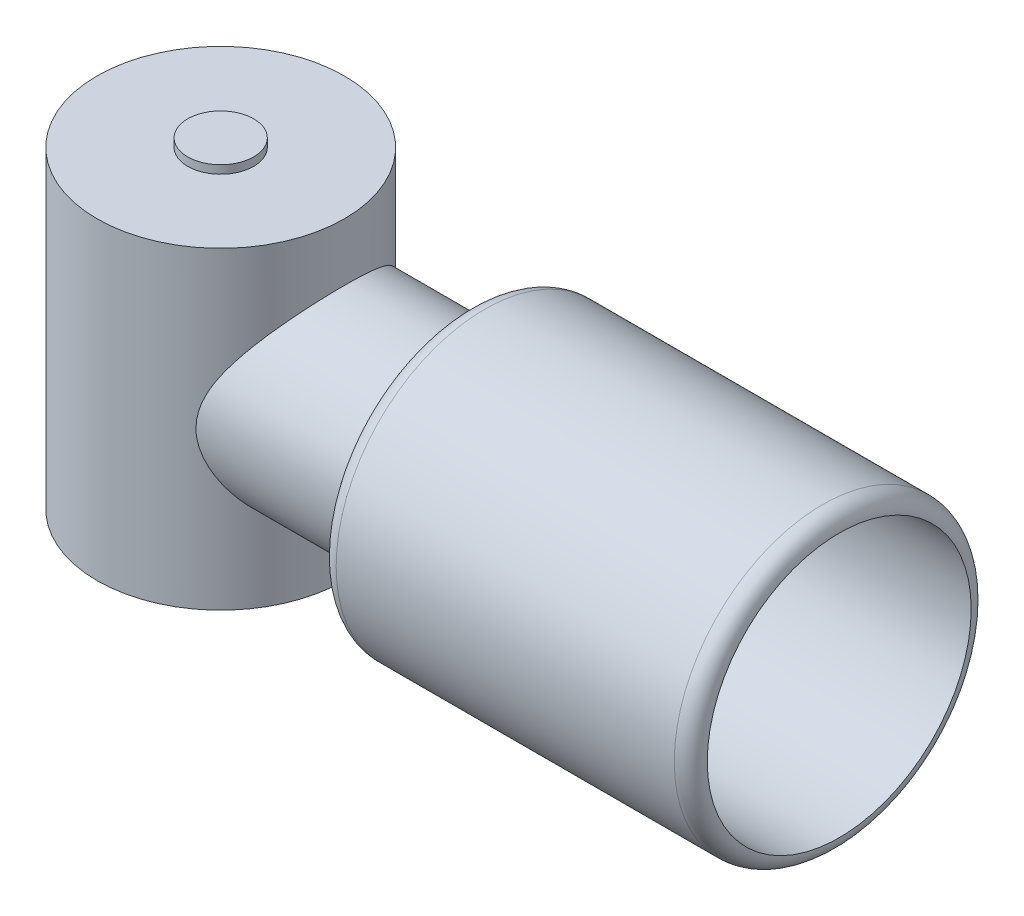
ISO-10303-21;
HEADER;
FILE_DESCRIPTION(('STEP AP214'),'2;1');
FILE_NAME('part.step','',(''),(''),'','','');
FILE_SCHEMA(('AUTOMOTIVE_DESIGN { 1 0 10303 214 1 1 1 1 }'));
ENDSEC;
DATA;
#1=APPLICATION_CONTEXT('core data for automotive mechanical design processes');
#2=APPLICATION_PROTOCOL_DEFINITION('international standard','automotive_design',2000,#1);
#3=PRODUCT_CONTEXT('',#1,'mechanical');
#4=PRODUCT('Part','Part','',(#3));
#5=PRODUCT_RELATED_PRODUCT_CATEGORY('part','',(#4));
#6=PRODUCT_DEFINITION_FORMATION('','',#4);
#7=PRODUCT_DEFINITION_CONTEXT('part definition',#1,'design');
#8=PRODUCT_DEFINITION('design','',#6,#7);
#9=PRODUCT_DEFINITION_SHAPE('','',#8);
#10=(LENGTH_UNIT() NAMED_UNIT(*) SI_UNIT(.MILLI.,.METRE.));
#11=(NAMED_UNIT(*) PLANE_ANGLE_UNIT() SI_UNIT($,.RADIAN.));
#12=(NAMED_UNIT(*) SI_UNIT($,.STERADIAN.) SOLID_ANGLE_UNIT());
#13=UNCERTAINTY_MEASURE_WITH_UNIT(LENGTH_MEASURE(1.E-05),#10,'distance_accuracy_value','');
#14=(GEOMETRIC_REPRESENTATION_CONTEXT(3) GLOBAL_UNCERTAINTY_ASSIGNED_CONTEXT((#13)) GLOBAL_UNIT_ASSIGNED_CONTEXT((#10,
#11,#12)) REPRESENTATION_CONTEXT('',''));
#15=CARTESIAN_POINT('',(0.,0.,0.));
#16=DIRECTION('',(0.,0.,1.));
#17=DIRECTION('',(1.,0.,0.));
#18=AXIS2_PLACEMENT_3D('',#15,#16,#17);
#19=CARTESIAN_POINT('',(0.,20.,0.));
#20=DIRECTION('',(0.,1.,0.));
#21=DIRECTION('',(0.,0.,1.));
#22=AXIS2_PLACEMENT_3D('',#19,#20,#21);
#23=CYLINDRICAL_SURFACE('',#22,15.);
#24=CARTESIAN_POINT('',(0.,-19.,0.));
#25=DIRECTION('',(0.,1.,0.));
#26=DIRECTION('',(0.,0.,1.));
#27=AXIS2_PLACEMENT_3D('',#24,#25,#26);
#28=CIRCLE('',#27,15.);
#29=CARTESIAN_POINT('',(0.,-19.,15.));
#30=VERTEX_POINT('',#29);
#31=EDGE_CURVE('E119',#30,#30,#28,.T.);
#32=ORIENTED_EDGE('',*,*,#31,.T.);
#33=EDGE_LOOP('',(#32));
#34=FACE_BOUND('',#33,.T.);
#35=CARTESIAN_POINT('',(0.,19.,0.));
#36=DIRECTION('',(0.,1.,0.));
#37=DIRECTION('',(0.,0.,1.));
#38=AXIS2_PLACEMENT_3D('',#35,#36,#37);
#39=CIRCLE('',#38,15.);
#40=CARTESIAN_POINT('',(0.,19.,15.));
#41=VERTEX_POINT('',#40);
#42=EDGE_CURVE('E57',#41,#41,#39,.T.);
#43=ORIENTED_EDGE('',*,*,#42,.F.);
#44=EDGE_LOOP('',(#43));
#45=FACE_BOUND('',#44,.T.);
#46=CARTESIAN_POINT('',(9.,0.,12.));
#47=CARTESIAN_POINT('',(9.00000534593475,0.225336896711603,11.9999977580923));
#48=CARTESIAN_POINT('',(9.00850517220196,0.450756200763366,11.9936356792837));
#49=CARTESIAN_POINT('',(9.04208551213308,0.899734141055137,11.9683378604446));
#50=CARTESIAN_POINT('',(9.06717733210229,1.12329140317996,11.9493935464452));
#51=CARTESIAN_POINT('',(9.13280932479141,1.56734322734625,11.899306326707));
#52=CARTESIAN_POINT('',(9.17339097684819,1.78782790382989,11.8681306610259));
#53=CARTESIAN_POINT('',(9.26824142745593,2.22388067664312,11.794206381086));
#54=CARTESIAN_POINT('',(9.32251506112583,2.43944700674687,11.7514536781771));
#55=CARTESIAN_POINT('',(9.46368365421338,2.93887172207276,11.6382758692652));
#56=CARTESIAN_POINT('',(9.55535701328816,3.22037289072252,11.5633987228413));
#57=CARTESIAN_POINT('',(9.75505249858976,3.77190253392778,11.3954358396261));
#58=CARTESIAN_POINT('',(9.86308203930986,4.04192573389168,11.302341839246));
#59=CARTESIAN_POINT('',(10.0913575975156,4.57083581680915,11.0990049699733));
#60=CARTESIAN_POINT('',(10.2116306750283,4.82969614981719,10.9887238164715));
#61=CARTESIAN_POINT('',(10.4604790537847,5.3357414022928,10.7521105598145));
#62=CARTESIAN_POINT('',(10.5890541442799,5.58292661786045,10.6257788640274));
#63=CARTESIAN_POINT('',(10.8988977434831,6.15323654333372,10.3091795170634));
#64=CARTESIAN_POINT('',(11.0824071596072,6.47149718215693,10.1123119228316));
#65=CARTESIAN_POINT('',(11.4528018887125,7.08710328868032,9.69082806297777));
#66=CARTESIAN_POINT('',(11.639688392718,7.38444118903451,9.46620183773787));
#67=CARTESIAN_POINT('',(12.011402413245,7.9574653550963,8.98985147043489));
#68=CARTESIAN_POINT('',(12.1962314628727,8.23316881829286,8.73814923666884));
#69=CARTESIAN_POINT('',(12.5592749633941,8.76198044386478,8.2077913274691));
#70=CARTESIAN_POINT('',(12.7374916020085,9.01509611908128,7.92914467865136));
#71=CARTESIAN_POINT('',(13.0488265703224,9.44933805059659,7.402856556035));
#72=CARTESIAN_POINT('',(13.1839031479475,9.63481232603252,7.15995147078525));
#73=CARTESIAN_POINT('',(13.4447133432109,9.98872497570729,6.65731250510476));
#74=CARTESIAN_POINT('',(13.5704487658596,10.1571666434748,6.39758189415741));
#75=CARTESIAN_POINT('',(13.8101743447818,10.4752961726256,5.86216844144648));
#76=CARTESIAN_POINT('',(13.92417827856,10.6250060783418,5.58650491979562));
#77=CARTESIAN_POINT('',(14.1383188864075,10.9041310881523,5.01992015578025));
#78=CARTESIAN_POINT('',(14.2384578605831,11.033549558936,4.72900145521727));
#79=CARTESIAN_POINT('',(14.4077438286833,11.2510868305872,4.18153490678308));
#80=CARTESIAN_POINT('',(14.4792839768026,11.3424999266453,3.92703273938234));
#81=CARTESIAN_POINT('',(14.6098022890139,11.5086475232899,3.40952368941159));
#82=CARTESIAN_POINT('',(14.6687828468481,11.5833852021872,3.14651843847694));
#83=CARTESIAN_POINT('',(14.7730555818549,11.7151523068893,2.61352930324073));
#84=CARTESIAN_POINT('',(14.8183523671225,11.772187694228,2.34354780155634));
#85=CARTESIAN_POINT('',(14.8943597076263,11.8677204874231,1.79828043764154));
#86=CARTESIAN_POINT('',(14.9250700886937,11.9062176719243,1.52299451211453));
#87=CARTESIAN_POINT('',(14.9713198002126,11.9641432051067,0.968164357538668));
#88=CARTESIAN_POINT('',(14.9868054893703,11.9835041321099,0.688608571497582));
#89=CARTESIAN_POINT('',(15.0020675270665,12.0025856866991,0.128395225325741));
#90=CARTESIAN_POINT('',(15.0018438453866,12.0023062765053,-0.15226233692334));
#91=CARTESIAN_POINT('',(14.9856922836252,11.9821120630282,-0.712420795127686));
#92=CARTESIAN_POINT('',(14.9697638718,11.9621965948912,-0.991921651596474));
#93=CARTESIAN_POINT('',(14.9225608310613,11.9030726502118,-1.54755149431533));
#94=CARTESIAN_POINT('',(14.8912865561,11.863864618652,-1.8236805581852));
#95=CARTESIAN_POINT('',(14.8161869606421,11.769459009883,-2.35558281632852));
#96=CARTESIAN_POINT('',(14.773140913335,11.7152523026543,-2.61164379383935));
#97=CARTESIAN_POINT('',(14.6747403868935,11.590920979812,-3.11743003424172));
#98=CARTESIAN_POINT('',(14.6193864604449,11.5207970789574,-3.36715558106512));
#99=CARTESIAN_POINT('',(14.4973196866331,11.3654996258046,-3.85900682695143));
#100=CARTESIAN_POINT('',(14.4306071040396,11.2803264243028,-4.10113270300635));
#101=CARTESIAN_POINT('',(14.2868526958553,11.0958327045157,-4.57685684863348));
#102=CARTESIAN_POINT('',(14.2098070902368,10.9965070081288,-4.81045195750258));
#103=CARTESIAN_POINT('',(14.0386849302236,10.7745137304916,-5.29020351270808));
#104=CARTESIAN_POINT('',(13.9436836975575,10.6505211723526,-5.53541648917584));
#105=CARTESIAN_POINT('',(13.7441012083129,10.3878588269558,-6.01389375128235));
#106=CARTESIAN_POINT('',(13.639515998348,10.2491829791481,-6.24715304360806));
#107=CARTESIAN_POINT('',(13.4222867655211,9.95827031972049,-6.70116079175292));
#108=CARTESIAN_POINT('',(13.3096414330644,9.80603130339082,-6.92190720401076));
#109=CARTESIAN_POINT('',(13.0777952173513,9.48896320243383,-7.35055533838977));
#110=CARTESIAN_POINT('',(12.9585934504079,9.3241324194974,-7.55845532098987));
#111=CARTESIAN_POINT('',(12.6900383983145,8.94751048465738,-8.00271521596878));
#112=CARTESIAN_POINT('',(12.5395331598783,8.73304115456968,-8.23611297709571));
#113=CARTESIAN_POINT('',(12.2337954887429,8.28805787975432,-8.68376254470619));
#114=CARTESIAN_POINT('',(12.0785622801605,8.0575412935257,-8.89801118577888));
#115=CARTESIAN_POINT('',(11.7659701803067,7.58092820787633,-9.3074350269514));
#116=CARTESIAN_POINT('',(11.6086090232722,7.33481387047092,-9.50258771538535));
#117=CARTESIAN_POINT('',(11.294987904498,6.82762773451224,-9.87330575529426));
#118=CARTESIAN_POINT('',(11.1387278129911,6.56655773284215,-10.0488734524144));
#119=CARTESIAN_POINT('',(10.8456285701826,6.05534297449387,-10.3640770356156));
#120=CARTESIAN_POINT('',(10.7083687628107,5.80656894162597,-10.5055450880884));
#121=CARTESIAN_POINT('',(10.4406280449055,5.29658673401075,-10.7716712253137));
#122=CARTESIAN_POINT('',(10.3101479108546,5.03537714154345,-10.8963273871821));
#123=CARTESIAN_POINT('',(10.0598945660622,4.50079770174653,-11.127781438788));
#124=CARTESIAN_POINT('',(9.94010336563904,4.22744949163076,-11.2346096076448));
#125=CARTESIAN_POINT('',(9.71545920331954,3.66819107573167,-11.4294337233122));
#126=CARTESIAN_POINT('',(9.6105994167876,3.38228668763677,-11.5174382830424));
#127=CARTESIAN_POINT('',(9.44968675371334,2.88680416673891,-11.6494960772356));
#128=CARTESIAN_POINT('',(9.38846449265114,2.68029528399006,-11.6987920140373));
#129=CARTESIAN_POINT('',(9.2777107829465,2.26198146148384,-11.7868184866234));
#130=CARTESIAN_POINT('',(9.22817554442481,2.0501782632809,-11.8255524480921));
#131=CARTESIAN_POINT('',(9.14268537794491,1.62249532276166,-11.8917717881921));
#132=CARTESIAN_POINT('',(9.10670582705021,1.40662372696992,-11.9192775696726));
#133=CARTESIAN_POINT('',(9.04974037513238,0.971724159331152,-11.9625871257979));
#134=CARTESIAN_POINT('',(9.02875414446727,0.752696256986462,-11.9783911577167));
#135=CARTESIAN_POINT('',(9.0026974595874,0.311845158225692,-11.9979879090824));
#136=CARTESIAN_POINT('',(8.99772158485407,0.0900130946441699,-12.0017092524971));
#137=CARTESIAN_POINT('',(9.00420338653544,-0.353266956490721,-11.9968468999912));
#138=CARTESIAN_POINT('',(9.01566080041498,-0.574714950123332,-11.9882634006506));
#139=CARTESIAN_POINT('',(9.05446038718717,-1.01565602582054,-11.9589852981963));
#140=CARTESIAN_POINT('',(9.08182159873641,-1.235146444134,-11.9382761791167));
#141=CARTESIAN_POINT('',(9.15117000529865,-1.6703626046178,-11.8851999983202));
#142=CARTESIAN_POINT('',(9.19315944953477,-1.88608776248571,-11.8528311437874));
#143=CARTESIAN_POINT('',(9.30237226944531,-2.36684969919688,-11.767404866684));
#144=CARTESIAN_POINT('',(9.37329680354322,-2.63048258931296,-11.7111800615462));
#145=CARTESIAN_POINT('',(9.53169041225851,-3.14866455280832,-11.5826272346947));
#146=CARTESIAN_POINT('',(9.61916464787385,-3.40321076300767,-11.5102941884025));
#147=CARTESIAN_POINT('',(9.8072143141123,-3.90323844261763,-11.3504975837445));
#148=CARTESIAN_POINT('',(9.90782137116947,-4.14869613190217,-11.2629973273402));
#149=CARTESIAN_POINT('',(10.1187031677338,-4.62978238656042,-11.0739298315741));
#150=CARTESIAN_POINT('',(10.2289783422763,-4.86541050892918,-10.9723619590936));
#151=CARTESIAN_POINT('',(10.5084827361846,-5.43268904622767,-10.7062636987059));
#152=CARTESIAN_POINT('',(10.6815885441585,-5.75891245063317,-10.5341964728359));
#153=CARTESIAN_POINT('',(11.0353879957735,-6.39127560933784,-10.1629755601994));
#154=CARTESIAN_POINT('',(11.2160847339051,-6.69740704012451,-9.96381075139339));
#155=CARTESIAN_POINT('',(11.5796099570042,-7.28986204305585,-9.53891479302859));
#156=CARTESIAN_POINT('',(11.762440368408,-7.57616578465706,-9.31315763963954));
#157=CARTESIAN_POINT('',(12.1252591020044,-8.12804339611084,-8.83561129980881));
#158=CARTESIAN_POINT('',(12.305247864177,-8.39362050073752,-8.58382618982565));
#159=CARTESIAN_POINT('',(12.6606482097247,-8.90655212570027,-8.05059758256504));
#160=CARTESIAN_POINT('',(12.8359571276623,-9.15359067803856,-7.76878052176302));
#161=CARTESIAN_POINT('',(13.1749823285129,-9.62322937695186,-7.17882893969065));
#162=CARTESIAN_POINT('',(13.3386967957586,-9.84582569891477,-6.87069031311184));
#163=CARTESIAN_POINT('',(13.649771306,-10.2633117941736,-6.22979022830051));
#164=CARTESIAN_POINT('',(13.7971750507411,-10.4582760174077,-5.89709875384123));
#165=CARTESIAN_POINT('',(14.0717725733971,-10.8179605313504,-5.20793427353997));
#166=CARTESIAN_POINT('',(14.1989777884893,-10.9826979459094,-4.85147488953823));
#167=CARTESIAN_POINT('',(14.3918639295043,-11.2307474212978,-4.23582765275947));
#168=CARTESIAN_POINT('',(14.4641564081937,-11.3231855673311,-3.98234304396571));
#169=CARTESIAN_POINT('',(14.5963013919825,-11.4915072325241,-3.46680405317605));
#170=CARTESIAN_POINT('',(14.6561571368553,-11.5673950633028,-3.20475192366046));
#171=CARTESIAN_POINT('',(14.762284185155,-11.7015690265281,-2.67362457217041));
#172=CARTESIAN_POINT('',(14.8085626808371,-11.7598644786282,-2.40455315107506));
#173=CARTESIAN_POINT('',(14.8866437379393,-11.8580372963764,-1.86097328134196));
#174=CARTESIAN_POINT('',(14.9184457847463,-11.8979140072703,-1.58646463978217));
#175=CARTESIAN_POINT('',(14.9669763510529,-11.9587088938429,-1.03299041128298));
#176=CARTESIAN_POINT('',(14.9836488249953,-11.9795565806018,-0.754012117346419));
#177=CARTESIAN_POINT('',(15.0013439104118,-12.001681697319,-0.194782200523185));
#178=CARTESIAN_POINT('',(15.0023665840164,-12.0029592049719,0.0854694173039015));
#179=CARTESIAN_POINT('',(14.9887388212363,-11.9859216240038,0.645007534582207));
#180=CARTESIAN_POINT('',(14.9740873811682,-11.9676052807008,0.924293971079601));
#181=CARTESIAN_POINT('',(14.9294394667087,-11.9116936608859,1.47967817069084));
#182=CARTESIAN_POINT('',(14.8994433282722,-11.8740988064553,1.75577600348025));
#183=CARTESIAN_POINT('',(14.8267670165045,-11.7827730106711,2.28806316164965));
#184=CARTESIAN_POINT('',(14.7848534588453,-11.7300156997351,2.54452601505301));
#185=CARTESIAN_POINT('',(14.6886493555422,-11.6085225610409,3.05124308760346));
#186=CARTESIAN_POINT('',(14.6343593541509,-11.5397874359023,3.30149757922603));
#187=CARTESIAN_POINT('',(14.5143388793052,-11.3871968556772,3.79451477268354));
#188=CARTESIAN_POINT('',(14.4486085965491,-11.3033416526266,4.03727759931777));
#189=CARTESIAN_POINT('',(14.3067293996473,-11.1214094781016,4.5143618190359));
#190=CARTESIAN_POINT('',(14.2305766656746,-11.0233272916472,4.74868007722489));
#191=CARTESIAN_POINT('',(14.0614917890715,-10.8042052337636,5.22926411473353));
#192=CARTESIAN_POINT('',(13.9676588223078,-10.6818804361256,5.47462651417379));
#193=CARTESIAN_POINT('',(13.7703500197772,-10.4225535654067,5.95353455838647));
#194=CARTESIAN_POINT('',(13.6668702096938,-10.2855454395644,6.18707527116559));
#195=CARTESIAN_POINT('',(13.4517774578086,-9.99797129990693,6.64175743833844));
#196=CARTESIAN_POINT('',(13.3401634313978,-9.84740347742059,6.86289723222285));
#197=CARTESIAN_POINT('',(13.1102887347224,-9.53368059422796,7.29244028447891));
#198=CARTESIAN_POINT('',(12.9920271661101,-9.37052383113841,7.5008418134213));
#199=CARTESIAN_POINT('',(12.725599157349,-8.99784296604335,7.94603518839181));
#200=CARTESIAN_POINT('',(12.5762654811263,-8.78566284790588,8.1799095046407));
#201=CARTESIAN_POINT('',(12.2726946544094,-8.3453271941456,8.62869484516627));
#202=CARTESIAN_POINT('',(12.1184567176533,-8.11716908977388,8.84360280764965));
#203=CARTESIAN_POINT('',(11.8076247385765,-7.64536160607647,9.25453594237483));
#204=CARTESIAN_POINT('',(11.6510281298568,-7.40169425756251,9.45053852438702));
#205=CARTESIAN_POINT('',(11.3386357369434,-6.89951704412927,9.82315741867348));
#206=CARTESIAN_POINT('',(11.1828398660056,-6.64100882549096,9.99977587490246));
#207=CARTESIAN_POINT('',(10.8878533098686,-6.13067100428086,10.3197919837101));
#208=CARTESIAN_POINT('',(10.7483380158318,-5.87998929242402,10.4647207743406));
#209=CARTESIAN_POINT('',(10.4759374491282,-5.36589302044452,10.7374048504859));
#210=CARTESIAN_POINT('',(10.343053064597,-5.10247676392629,10.8651578393577));
#211=CARTESIAN_POINT('',(10.0878847040138,-4.56309193014241,11.1024724825399));
#212=CARTESIAN_POINT('',(9.96558631918956,-4.28714121991041,11.2120590556011));
#213=CARTESIAN_POINT('',(9.73598569200713,-3.7223493874955,11.4120002684213));
#214=CARTESIAN_POINT('',(9.62867591895238,-3.43351483545793,11.5023645780031));
#215=CARTESIAN_POINT('',(9.46314507809602,-2.93079512214604,11.6385890748231));
#216=CARTESIAN_POINT('',(9.39979375218347,-2.72001779538785,11.6897064018268));
#217=CARTESIAN_POINT('',(9.28520549175198,-2.29288523192801,11.7809306424187));
#218=CARTESIAN_POINT('',(9.23396430838441,-2.07653198117658,11.821041418458));
#219=CARTESIAN_POINT('',(9.14567348443244,-1.63979495516657,11.8894818688654));
#220=CARTESIAN_POINT('',(9.10858095011498,-1.41942551887215,11.917847174113));
#221=CARTESIAN_POINT('',(9.05004150322829,-0.975479372782677,11.9623628470045));
#222=CARTESIAN_POINT('',(9.0285836360653,-0.751905020757761,11.9785217674724));
#223=CARTESIAN_POINT('',(9.0103140767982,-0.43985490718893,11.9922586429555));
#224=CARTESIAN_POINT('',(9.00645053406153,-0.351963808741019,11.9951598460703));
#225=CARTESIAN_POINT('',(9.00129228417886,-0.17605267617005,11.9990310882364));
#226=CARTESIAN_POINT('',(8.99999791149747,-0.0880326267521128,12.0000008758487));
#227=CARTESIAN_POINT('',(9.,0.,12.));
#228=B_SPLINE_CURVE_WITH_KNOTS('',3,(#46,#47,#48,#49,#50,#51,#52,#53,#54,#55,#56,#57,#58,#59,
#60,#61,#62,#63,#64,#65,#66,#67,#68,#69,#70,#71,#72,#73,#74,#75,#76,#77,#78,#79,#80,#81,#82,#83,
#84,#85,#86,#87,#88,#89,#90,#91,#92,#93,#94,#95,#96,#97,#98,#99,#100,#101,#102,#103,#104,#105,
#106,#107,#108,#109,#110,#111,#112,#113,#114,#115,#116,#117,#118,#119,#120,#121,#122,#123,#124,
#125,#126,#127,#128,#129,#130,#131,#132,#133,#134,#135,#136,#137,#138,#139,#140,#141,#142,#143,
#144,#145,#146,#147,#148,#149,#150,#151,#152,#153,#154,#155,#156,#157,#158,#159,#160,#161,#162,
#163,#164,#165,#166,#167,#168,#169,#170,#171,#172,#173,#174,#175,#176,#177,#178,#179,#180,#181,
#182,#183,#184,#185,#186,#187,#188,#189,#190,#191,#192,#193,#194,#195,#196,#197,#198,#199,#200,
#201,#202,#203,#204,#205,#206,#207,#208,#209,#210,#211,#212,#213,#214,#215,#216,#217,#218,#219,
#220,#221,#222,#223,#224,#225,#226,#227),.UNSPECIFIED.,.T.,.F.,(4,2,2,2,2,2,2,2,2,2,2,2,2,2,2,2,
2,2,2,2,2,2,2,2,2,2,2,2,2,2,2,2,2,2,2,2,2,2,2,2,2,2,2,2,2,2,2,2,2,2,2,2,2,2,2,2,2,2,2,2,2,2,2,2,
2,2,2,2,2,2,2,2,2,2,2,2,2,2,2,2,2,2,2,2,2,2,2,2,2,2,4),(0.,0.675909449714826,1.35227996064252,
2.03047453871311,2.7089089471408,3.62357877542799,4.53866448510835,5.45581848833655,
6.37294921853625,7.62174294392466,8.87098603648071,10.11922581264,11.3670488567802,
12.3685697488929,13.3698966090032,14.3700337542159,15.3700047838959,16.2083336302392,
17.0465025555383,17.8843889068156,18.7222852626181,19.5631233181134,20.4039629910354,
21.2448311347757,22.0856798848153,22.8805786676179,23.6754417626764,24.4702863320698,
25.2654224687958,26.1368065453225,27.0085516994439,27.8804388162608,28.7524437368076,
29.8041190660129,30.8559679202304,31.9090421957503,32.9619902114896,33.9134927246421,
34.8651039751338,35.8150821846218,36.7646247883574,37.4269710038763,38.0891021369818,
38.7500246903732,39.4109327123251,40.0757378782557,40.7405324235017,41.4061244473697,
42.0718188572351,42.9067245387317,43.7418910146712,44.579107179055,45.416361034936,
46.636929820115,47.8580011002629,49.0802764987762,50.3023607555979,51.5419717831313,
52.781776503931,54.0181745559794,55.2538699963663,56.0910600945918,56.9280318303311,
57.7645593944648,58.6011166934113,59.4407604090743,60.2804007913061,61.1200949426805,
61.9597707106799,62.7544095620967,63.5490134761125,64.3436041461293,65.1384868172883,
66.0069881972994,66.8758489781165,67.7448258247847,68.6139203885151,69.6608662052068,
70.7079807254072,71.7563313429268,72.8045658919596,73.7681085913147,74.731780001826,
75.6941184123759,76.6559715645379,77.3332531875902,78.0102968321594,78.6852712885749,
79.3597723610718,79.6237963201963,79.8878546487404),.UNSPECIFIED.);
#229=CARTESIAN_POINT('',(9.,0.,12.));
#230=VERTEX_POINT('',#229);
#231=EDGE_CURVE('E60',#230,#230,#228,.T.);
#232=ORIENTED_EDGE('',*,*,#231,.T.);
#233=EDGE_LOOP('',(#232));
#234=FACE_BOUND('',#233,.T.);
#235=ADVANCED_FACE('F39',(#34,#45,#234),#23,.T.);
#236=CARTESIAN_POINT('',(-4.,19.,0.));
#237=DIRECTION('',(0.,1.,0.));
#238=DIRECTION('',(0.,0.,1.));
#239=AXIS2_PLACEMENT_3D('',#236,#237,#238);
#240=PLANE('',#239);
#241=ORIENTED_EDGE('',*,*,#42,.T.);
#242=EDGE_LOOP('',(#241));
#243=FACE_BOUND('',#242,.T.);
#244=CARTESIAN_POINT('',(0.,19.,0.));
#245=DIRECTION('',(0.,1.,0.));
#246=DIRECTION('',(0.,0.,1.));
#247=AXIS2_PLACEMENT_3D('',#244,#245,#246);
#248=CIRCLE('',#247,4.);
#249=CARTESIAN_POINT('',(0.,19.,4.));
#250=VERTEX_POINT('',#249);
#251=EDGE_CURVE('E113',#250,#250,#248,.T.);
#252=ORIENTED_EDGE('',*,*,#251,.F.);
#253=EDGE_LOOP('',(#252));
#254=FACE_BOUND('',#253,.T.);
#255=ADVANCED_FACE('F100',(#243,#254),#240,.T.);
#256=CARTESIAN_POINT('',(0.,20.,0.));
#257=DIRECTION('',(0.,1.,0.));
#258=DIRECTION('',(0.,0.,1.));
#259=AXIS2_PLACEMENT_3D('',#256,#257,#258);
#260=CYLINDRICAL_SURFACE('',#259,4.);
#261=ORIENTED_EDGE('',*,*,#251,.T.);
#262=EDGE_LOOP('',(#261));
#263=FACE_BOUND('',#262,.T.);
#264=CARTESIAN_POINT('',(0.,20.,0.));
#265=DIRECTION('',(0.,1.,0.));
#266=DIRECTION('',(0.,0.,1.));
#267=AXIS2_PLACEMENT_3D('',#264,#265,#266);
#268=CIRCLE('',#267,4.);
#269=CARTESIAN_POINT('',(0.,20.,4.));
#270=VERTEX_POINT('',#269);
#271=EDGE_CURVE('E115',#270,#270,#268,.T.);
#272=ORIENTED_EDGE('',*,*,#271,.F.);
#273=EDGE_LOOP('',(#272));
#274=FACE_BOUND('',#273,.T.);
#275=ADVANCED_FACE('F97',(#263,#274),#260,.T.);
#276=CARTESIAN_POINT('',(0.,20.,0.));
#277=DIRECTION('',(0.,1.,0.));
#278=DIRECTION('',(0.,0.,1.));
#279=AXIS2_PLACEMENT_3D('',#276,#277,#278);
#280=PLANE('',#279);
#281=ORIENTED_EDGE('',*,*,#271,.T.);
#282=EDGE_LOOP('',(#281));
#283=FACE_BOUND('',#282,.T.);
#284=ADVANCED_FACE('F93',(#283),#280,.T.);
#285=CARTESIAN_POINT('',(-4.,-19.,0.));
#286=DIRECTION('',(0.,-1.,0.));
#287=DIRECTION('',(0.,0.,1.));
#288=AXIS2_PLACEMENT_3D('',#285,#286,#287);
#289=PLANE('',#288);
#290=ORIENTED_EDGE('',*,*,#31,.F.);
#291=EDGE_LOOP('',(#290));
#292=FACE_BOUND('',#291,.T.);
#293=CARTESIAN_POINT('',(0.,-19.,0.));
#294=DIRECTION('',(0.,1.,0.));
#295=DIRECTION('',(0.,0.,1.));
#296=AXIS2_PLACEMENT_3D('',#293,#294,#295);
#297=CIRCLE('',#296,4.);
#298=CARTESIAN_POINT('',(0.,-19.,4.));
#299=VERTEX_POINT('',#298);
#300=EDGE_CURVE('E125',#299,#299,#297,.T.);
#301=ORIENTED_EDGE('',*,*,#300,.T.);
#302=EDGE_LOOP('',(#301));
#303=FACE_BOUND('',#302,.T.);
#304=ADVANCED_FACE('F89',(#292,#303),#289,.T.);
#305=CARTESIAN_POINT('',(0.,-20.,0.));
#306=DIRECTION('',(0.,-1.,0.));
#307=DIRECTION('',(0.,0.,1.));
#308=AXIS2_PLACEMENT_3D('',#305,#306,#307);
#309=CYLINDRICAL_SURFACE('',#308,4.);
#310=ORIENTED_EDGE('',*,*,#300,.F.);
#311=EDGE_LOOP('',(#310));
#312=FACE_BOUND('',#311,.T.);
#313=CARTESIAN_POINT('',(0.,-20.,0.));
#314=DIRECTION('',(0.,1.,0.));
#315=DIRECTION('',(0.,0.,1.));
#316=AXIS2_PLACEMENT_3D('',#313,#314,#315);
#317=CIRCLE('',#316,4.);
#318=CARTESIAN_POINT('',(0.,-20.,4.));
#319=VERTEX_POINT('',#318);
#320=EDGE_CURVE('E69',#319,#319,#317,.T.);
#321=ORIENTED_EDGE('',*,*,#320,.T.);
#322=EDGE_LOOP('',(#321));
#323=FACE_BOUND('',#322,.T.);
#324=ADVANCED_FACE('F85',(#312,#323),#309,.T.);
#325=CARTESIAN_POINT('',(0.,-20.,0.));
#326=DIRECTION('',(0.,-1.,0.));
#327=DIRECTION('',(0.,0.,1.));
#328=AXIS2_PLACEMENT_3D('',#325,#326,#327);
#329=PLANE('',#328);
#330=ORIENTED_EDGE('',*,*,#320,.F.);
#331=EDGE_LOOP('',(#330));
#332=FACE_BOUND('',#331,.T.);
#333=ADVANCED_FACE('F80',(#332),#329,.T.);
#334=CARTESIAN_POINT('',(30.,0.,0.));
#335=DIRECTION('',(-1.,0.,0.));
#336=DIRECTION('',(0.,0.,1.));
#337=AXIS2_PLACEMENT_3D('',#334,#335,#336);
#338=CYLINDRICAL_SURFACE('',#337,12.);
#339=ORIENTED_EDGE('',*,*,#231,.F.);
#340=EDGE_LOOP('',(#339));
#341=FACE_BOUND('',#340,.T.);
#342=CARTESIAN_POINT('',(30.,0.,0.));
#343=DIRECTION('',(1.,0.,0.));
#344=DIRECTION('',(0.,0.,-1.));
#345=AXIS2_PLACEMENT_3D('',#342,#343,#344);
#346=CIRCLE('',#345,12.);
#347=CARTESIAN_POINT('',(30.,0.,-12.));
#348=VERTEX_POINT('',#347);
#349=EDGE_CURVE('E70',#348,#348,#346,.T.);
#350=ORIENTED_EDGE('',*,*,#349,.F.);
#351=EDGE_LOOP('',(#350));
#352=FACE_BOUND('',#351,.T.);
#353=ADVANCED_FACE('F74',(#341,#352),#338,.T.);
#354=CARTESIAN_POINT('',(75.,0.,0.));
#355=DIRECTION('',(-1.,0.,0.));
#356=DIRECTION('',(0.,0.,1.));
#357=AXIS2_PLACEMENT_3D('',#354,#355,#356);
#358=CYLINDRICAL_SURFACE('',#357,18.);
#359=CARTESIAN_POINT('',(73.,0.,0.));
#360=DIRECTION('',(1.,0.,0.));
#361=DIRECTION('',(0.,0.,-1.));
#362=AXIS2_PLACEMENT_3D('',#359,#360,#361);
#363=CIRCLE('',#362,18.);
#364=CARTESIAN_POINT('',(73.,0.,18.));
#365=VERTEX_POINT('',#364);
#366=EDGE_CURVE('E47',#365,#365,#363,.F.);
#367=CARTESIAN_POINT('',(32.,0.,0.));
#368=DIRECTION('',(1.,0.,0.));
#369=DIRECTION('',(0.,0.,-1.));
#370=AXIS2_PLACEMENT_3D('',#367,#368,#369);
#371=CIRCLE('',#370,18.);
#372=CARTESIAN_POINT('',(32.,0.,18.));
#373=VERTEX_POINT('',#372);
#374=EDGE_CURVE('E52',#373,#373,#371,.T.);
#375=CARTESIAN_POINT('',(73.,0.,18.));
#376=CARTESIAN_POINT('',(72.5729166666667,0.,18.));
#377=CARTESIAN_POINT('',(72.1458333333333,0.,18.));
#378=CARTESIAN_POINT('',(71.2916666666667,0.,18.));
#379=CARTESIAN_POINT('',(70.8645833333333,0.,18.));
#380=CARTESIAN_POINT('',(70.0104166666667,0.,18.));
#381=CARTESIAN_POINT('',(69.5833333333333,0.,18.));
#382=CARTESIAN_POINT('',(68.7291666666667,0.,18.));
#383=CARTESIAN_POINT('',(68.3020833333333,0.,18.));
#384=CARTESIAN_POINT('',(67.4479166666667,0.,18.));
#385=CARTESIAN_POINT('',(67.0208333333333,0.,18.));
#386=CARTESIAN_POINT('',(66.1666666666667,0.,18.));
#387=CARTESIAN_POINT('',(65.7395833333333,0.,18.));
#388=CARTESIAN_POINT('',(64.8854166666667,0.,18.));
#389=CARTESIAN_POINT('',(64.4583333333333,0.,18.));
#390=CARTESIAN_POINT('',(63.6041666666667,0.,18.));
#391=CARTESIAN_POINT('',(63.1770833333333,0.,18.));
#392=CARTESIAN_POINT('',(62.3229166666667,0.,18.));
#393=CARTESIAN_POINT('',(61.8958333333333,0.,18.));
#394=CARTESIAN_POINT('',(61.0416666666667,0.,18.));
#395=CARTESIAN_POINT('',(60.6145833333333,0.,18.));
#396=CARTESIAN_POINT('',(59.7604166666667,0.,18.));
#397=CARTESIAN_POINT('',(59.3333333333333,0.,18.));
#398=CARTESIAN_POINT('',(58.4791666666667,0.,18.));
#399=CARTESIAN_POINT('',(58.0520833333333,0.,18.));
#400=CARTESIAN_POINT('',(57.1979166666667,0.,18.));
#401=CARTESIAN_POINT('',(56.7708333333333,0.,18.));
#402=CARTESIAN_POINT('',(55.9166666666667,0.,18.));
#403=CARTESIAN_POINT('',(55.4895833333333,0.,18.));
#404=CARTESIAN_POINT('',(54.6354166666667,0.,18.));
#405=CARTESIAN_POINT('',(54.2083333333333,0.,18.));
#406=CARTESIAN_POINT('',(53.3541666666667,0.,18.));
#407=CARTESIAN_POINT('',(52.9270833333333,0.,18.));
#408=CARTESIAN_POINT('',(52.0729166666667,0.,18.));
#409=CARTESIAN_POINT('',(51.6458333333333,0.,18.));
#410=CARTESIAN_POINT('',(50.7916666666667,0.,18.));
#411=CARTESIAN_POINT('',(50.3645833333333,0.,18.));
#412=CARTESIAN_POINT('',(49.5104166666667,0.,18.));
#413=CARTESIAN_POINT('',(49.0833333333333,0.,18.));
#414=CARTESIAN_POINT('',(48.2291666666667,0.,18.));
#415=CARTESIAN_POINT('',(47.8020833333333,0.,18.));
#416=CARTESIAN_POINT('',(46.9479166666667,0.,18.));
#417=CARTESIAN_POINT('',(46.5208333333333,0.,18.));
#418=CARTESIAN_POINT('',(45.6666666666667,0.,18.));
#419=CARTESIAN_POINT('',(45.2395833333333,0.,18.));
#420=CARTESIAN_POINT('',(44.3854166666667,0.,18.));
#421=CARTESIAN_POINT('',(43.9583333333333,0.,18.));
#422=CARTESIAN_POINT('',(43.1041666666667,0.,18.));
#423=CARTESIAN_POINT('',(42.6770833333333,0.,18.));
#424=CARTESIAN_POINT('',(41.8229166666667,0.,18.));
#425=CARTESIAN_POINT('',(41.3958333333333,0.,18.));
#426=CARTESIAN_POINT('',(40.5416666666667,0.,18.));
#427=CARTESIAN_POINT('',(40.1145833333333,0.,18.));
#428=CARTESIAN_POINT('',(39.2604166666667,0.,18.));
#429=CARTESIAN_POINT('',(38.8333333333333,0.,18.));
#430=CARTESIAN_POINT('',(37.9791666666667,0.,18.));
#431=CARTESIAN_POINT('',(37.5520833333333,0.,18.));
#432=CARTESIAN_POINT('',(36.6979166666667,0.,18.));
#433=CARTESIAN_POINT('',(36.2708333333333,0.,18.));
#434=CARTESIAN_POINT('',(35.4166666666667,0.,18.));
#435=CARTESIAN_POINT('',(34.9895833333333,0.,18.));
#436=CARTESIAN_POINT('',(34.1354166666667,0.,18.));
#437=CARTESIAN_POINT('',(33.7083333333333,0.,18.));
#438=CARTESIAN_POINT('',(32.8541666666667,0.,18.));
#439=CARTESIAN_POINT('',(32.4270833333333,0.,18.));
#440=CARTESIAN_POINT('',(32.,0.,18.));
#441=B_SPLINE_CURVE_WITH_KNOTS('',3,(#375,#376,#377,#378,#379,#380,#381,#382,#383,#384,#385,
#386,#387,#388,#389,#390,#391,#392,#393,#394,#395,#396,#397,#398,#399,#400,#401,#402,#403,#404,
#405,#406,#407,#408,#409,#410,#411,#412,#413,#414,#415,#416,#417,#418,#419,#420,#421,#422,#423,
#424,#425,#426,#427,#428,#429,#430,#431,#432,#433,#434,#435,#436,#437,#438,#439,#440),
.UNSPECIFIED.,.F.,.F.,(4,2,2,2,2,2,2,2,2,2,2,2,2,2,2,2,2,2,2,2,2,2,2,2,2,2,2,2,2,2,2,2,4),(0.,
1.28125000000001,2.56250000000001,3.84375000000001,5.125,6.40625,7.6875,8.96875000000001,10.25,
11.53125,12.8125,14.09375,15.375,16.65625,17.9375,19.21875,20.5,21.78125,23.0625,24.34375,
25.625,26.90625,28.1875,29.46875,30.75,32.03125,33.3125,34.59375,35.875,37.15625,38.4375,
39.71875,41.),.UNSPECIFIED.);
#442=EDGE_CURVE('BSEAM79',#365,#373,#441,.T.);
#443=ORIENTED_EDGE('',*,*,#366,.T.);
#444=ORIENTED_EDGE('',*,*,#374,.T.);
#445=ORIENTED_EDGE('',*,*,#442,.T.);
#446=ORIENTED_EDGE('',*,*,#442,.F.);
#447=EDGE_LOOP('',(#443,#445,#444,#446));
#448=FACE_BOUND('',#447,.T.);
#449=ADVANCED_FACE('F79',(#448),#358,.T.);
#450=CARTESIAN_POINT('',(30.,0.,0.));
#451=DIRECTION('',(1.,0.,0.));
#452=DIRECTION('',(0.,0.,-1.));
#453=AXIS2_PLACEMENT_3D('',#450,#451,#452);
#454=PLANE('',#453);
#455=CARTESIAN_POINT('',(30.,0.,0.));
#456=DIRECTION('',(1.,0.,0.));
#457=DIRECTION('',(0.,0.,-1.));
#458=AXIS2_PLACEMENT_3D('',#455,#456,#457);
#459=CIRCLE('',#458,16.);
#460=CARTESIAN_POINT('',(30.,0.,-16.));
#461=VERTEX_POINT('',#460);
#462=EDGE_CURVE('E11',#461,#461,#459,.F.);
#463=ORIENTED_EDGE('',*,*,#462,.T.);
#464=EDGE_LOOP('',(#463));
#465=FACE_BOUND('',#464,.T.);
#466=ORIENTED_EDGE('',*,*,#349,.T.);
#467=EDGE_LOOP('',(#466));
#468=FACE_BOUND('',#467,.T.);
#469=ADVANCED_FACE('F160',(#465,#468),#454,.F.);
#470=CARTESIAN_POINT('',(-15.254833995939,0.,0.));
#471=DIRECTION('',(1.,0.,0.));
#472=DIRECTION('',(0.,0.,-1.));
#473=AXIS2_PLACEMENT_3D('',#470,#471,#472);
#474=CYLINDRICAL_SURFACE('',#473,16.);
#475=CARTESIAN_POINT('',(32.,0.,0.));
#476=DIRECTION('',(1.,0.,0.));
#477=DIRECTION('',(0.,0.,-1.));
#478=AXIS2_PLACEMENT_3D('',#475,#476,#477);
#479=CIRCLE('',#478,16.);
#480=CARTESIAN_POINT('',(32.,0.,-16.));
#481=VERTEX_POINT('',#480);
#482=EDGE_CURVE('E135',#481,#481,#479,.F.);
#483=ORIENTED_EDGE('',*,*,#482,.T.);
#484=EDGE_LOOP('',(#483));
#485=FACE_BOUND('',#484,.T.);
#486=CARTESIAN_POINT('',(75.,0.,0.));
#487=DIRECTION('',(1.,0.,0.));
#488=DIRECTION('',(0.,0.,-1.));
#489=AXIS2_PLACEMENT_3D('',#486,#487,#488);
#490=CIRCLE('',#489,16.);
#491=CARTESIAN_POINT('',(75.,0.,-16.));
#492=VERTEX_POINT('',#491);
#493=EDGE_CURVE('E139',#492,#492,#490,.T.);
#494=ORIENTED_EDGE('',*,*,#493,.T.);
#495=EDGE_LOOP('',(#494));
#496=FACE_BOUND('',#495,.T.);
#497=ADVANCED_FACE('F144',(#485,#496),#474,.F.);
#498=CARTESIAN_POINT('',(32.,0.,0.));
#499=DIRECTION('',(1.,0.,0.));
#500=DIRECTION('',(0.,0.,-1.));
#501=AXIS2_PLACEMENT_3D('',#498,#499,#500);
#502=PLANE('',#501);
#503=ORIENTED_EDGE('',*,*,#482,.F.);
#504=EDGE_LOOP('',(#503));
#505=FACE_BOUND('',#504,.T.);
#506=ADVANCED_FACE('F148',(#505),#502,.T.);
#507=CARTESIAN_POINT('',(73.,0.,0.));
#508=DIRECTION('',(1.,0.,0.));
#509=DIRECTION('',(0.,0.,-1.));
#510=AXIS2_PLACEMENT_3D('',#507,#508,#509);
#511=TOROIDAL_SURFACE('',#510,16.,2.);
#512=ORIENTED_EDGE('',*,*,#366,.F.);
#513=EDGE_LOOP('',(#512));
#514=FACE_BOUND('',#513,.T.);
#515=ORIENTED_EDGE('',*,*,#493,.F.);
#516=EDGE_LOOP('',(#515));
#517=FACE_BOUND('',#516,.T.);
#518=ADVANCED_FACE('F146',(#514,#517),#511,.T.);
#519=CARTESIAN_POINT('',(32.,0.,0.));
#520=DIRECTION('',(1.,0.,0.));
#521=DIRECTION('',(0.,0.,-1.));
#522=AXIS2_PLACEMENT_3D('',#519,#520,#521);
#523=TOROIDAL_SURFACE('',#522,16.,2.);
#524=ORIENTED_EDGE('',*,*,#462,.F.);
#525=EDGE_LOOP('',(#524));
#526=FACE_BOUND('',#525,.T.);
#527=ORIENTED_EDGE('',*,*,#374,.F.);
#528=EDGE_LOOP('',(#527));
#529=FACE_BOUND('',#528,.T.);
#530=ADVANCED_FACE('F41',(#526,#529),#523,.T.);
#531=CLOSED_SHELL('',(#235,#255,#275,#284,#304,#324,#333,#353,#449,#469,#497,#506,#518,#530));
#532=MANIFOLD_SOLID_BREP('B2',#531);
#533=ADVANCED_BREP_SHAPE_REPRESENTATION('',(#18,#532),#14);
#534=SHAPE_DEFINITION_REPRESENTATION(#9,#533);
ENDSEC;
END-ISO-10303-21;
